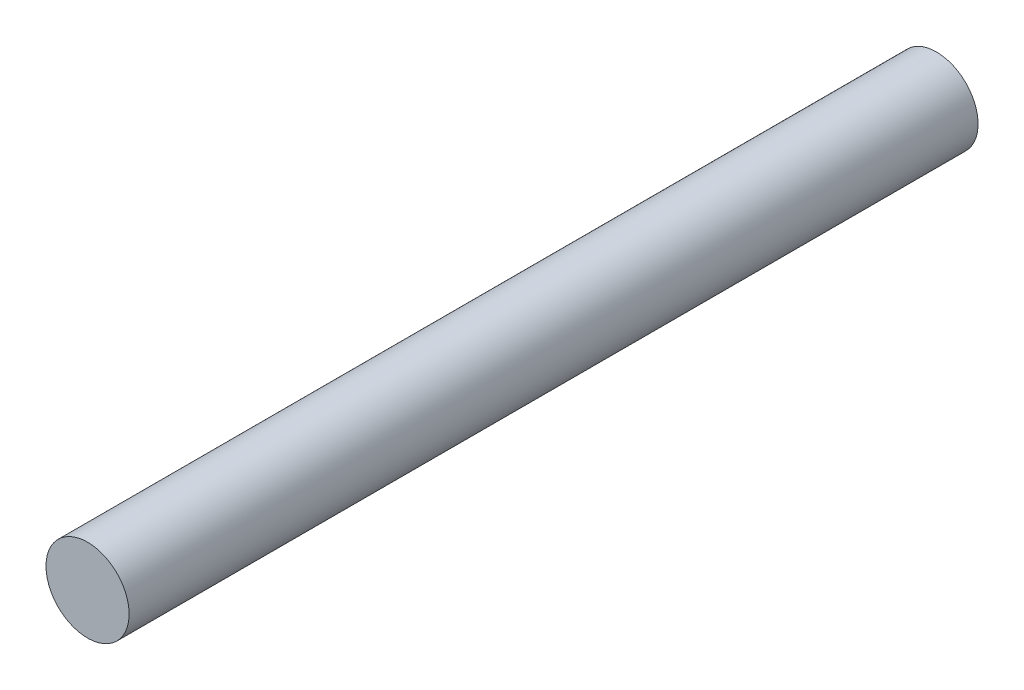
ISO-10303-21;
HEADER;
FILE_DESCRIPTION(('STEP AP214'),'2;1');
FILE_NAME('part.step','',(''),(''),'','','');
FILE_SCHEMA(('AUTOMOTIVE_DESIGN { 1 0 10303 214 1 1 1 1 }'));
ENDSEC;
DATA;
#1=APPLICATION_CONTEXT('core data for automotive mechanical design processes');
#2=APPLICATION_PROTOCOL_DEFINITION('international standard','automotive_design',2000,#1);
#3=PRODUCT_CONTEXT('',#1,'mechanical');
#4=PRODUCT('Part','Part','',(#3));
#5=PRODUCT_RELATED_PRODUCT_CATEGORY('part','',(#4));
#6=PRODUCT_DEFINITION_FORMATION('','',#4);
#7=PRODUCT_DEFINITION_CONTEXT('part definition',#1,'design');
#8=PRODUCT_DEFINITION('design','',#6,#7);
#9=PRODUCT_DEFINITION_SHAPE('','',#8);
#10=(LENGTH_UNIT() NAMED_UNIT(*) SI_UNIT(.MILLI.,.METRE.));
#11=(NAMED_UNIT(*) PLANE_ANGLE_UNIT() SI_UNIT($,.RADIAN.));
#12=(NAMED_UNIT(*) SI_UNIT($,.STERADIAN.) SOLID_ANGLE_UNIT());
#13=UNCERTAINTY_MEASURE_WITH_UNIT(LENGTH_MEASURE(1.E-05),#10,'distance_accuracy_value','');
#14=(GEOMETRIC_REPRESENTATION_CONTEXT(3) GLOBAL_UNCERTAINTY_ASSIGNED_CONTEXT((#13)) GLOBAL_UNIT_ASSIGNED_CONTEXT((#10,
#11,#12)) REPRESENTATION_CONTEXT('',''));
#15=CARTESIAN_POINT('',(0.,0.,0.));
#16=DIRECTION('',(0.,0.,1.));
#17=DIRECTION('',(1.,0.,0.));
#18=AXIS2_PLACEMENT_3D('',#15,#16,#17);
#19=CARTESIAN_POINT('',(0.,0.,97.282));
#20=DIRECTION('',(0.,0.,-1.));
#21=DIRECTION('',(-1.,0.,0.));
#22=AXIS2_PLACEMENT_3D('',#19,#20,#21);
#23=CYLINDRICAL_SURFACE('',#22,4.7625);
#24=CARTESIAN_POINT('',(0.,0.,97.282));
#25=DIRECTION('',(0.,0.,1.));
#26=DIRECTION('',(1.,0.,0.));
#27=AXIS2_PLACEMENT_3D('',#24,#25,#26);
#28=CIRCLE('',#27,4.7625);
#29=CARTESIAN_POINT('',(-4.7625,0.,97.282));
#30=VERTEX_POINT('',#29);
#31=EDGE_CURVE('E12',#30,#30,#28,.T.);
#32=CARTESIAN_POINT('',(0.,0.,0.));
#33=DIRECTION('',(0.,0.,1.));
#34=DIRECTION('',(1.,0.,0.));
#35=AXIS2_PLACEMENT_3D('',#32,#33,#34);
#36=CIRCLE('',#35,4.7625);
#37=CARTESIAN_POINT('',(-4.7625,0.,0.));
#38=VERTEX_POINT('',#37);
#39=EDGE_CURVE('E44',#38,#38,#36,.T.);
#40=CARTESIAN_POINT('',(-4.7625,0.,97.282));
#41=CARTESIAN_POINT('',(-4.7625,0.,96.2686458333333));
#42=CARTESIAN_POINT('',(-4.7625,0.,95.2552916666667));
#43=CARTESIAN_POINT('',(-4.7625,0.,93.2285833333333));
#44=CARTESIAN_POINT('',(-4.7625,0.,92.2152291666666));
#45=CARTESIAN_POINT('',(-4.7625,0.,90.1885208333333));
#46=CARTESIAN_POINT('',(-4.7625,0.,89.1751666666667));
#47=CARTESIAN_POINT('',(-4.7625,0.,87.1484583333333));
#48=CARTESIAN_POINT('',(-4.7625,0.,86.1351041666667));
#49=CARTESIAN_POINT('',(-4.7625,0.,84.1083958333333));
#50=CARTESIAN_POINT('',(-4.7625,0.,83.0950416666666));
#51=CARTESIAN_POINT('',(-4.7625,0.,81.0683333333333));
#52=CARTESIAN_POINT('',(-4.7625,0.,80.0549791666667));
#53=CARTESIAN_POINT('',(-4.7625,0.,78.0282708333333));
#54=CARTESIAN_POINT('',(-4.7625,0.,77.0149166666667));
#55=CARTESIAN_POINT('',(-4.7625,0.,74.9882083333333));
#56=CARTESIAN_POINT('',(-4.7625,0.,73.9748541666666));
#57=CARTESIAN_POINT('',(-4.7625,0.,71.9481458333333));
#58=CARTESIAN_POINT('',(-4.7625,0.,70.9347916666667));
#59=CARTESIAN_POINT('',(-4.7625,0.,68.9080833333333));
#60=CARTESIAN_POINT('',(-4.7625,0.,67.8947291666667));
#61=CARTESIAN_POINT('',(-4.7625,0.,65.8680208333333));
#62=CARTESIAN_POINT('',(-4.7625,0.,64.8546666666667));
#63=CARTESIAN_POINT('',(-4.7625,0.,62.8279583333333));
#64=CARTESIAN_POINT('',(-4.7625,0.,61.8146041666667));
#65=CARTESIAN_POINT('',(-4.7625,0.,59.7878958333333));
#66=CARTESIAN_POINT('',(-4.7625,0.,58.7745416666667));
#67=CARTESIAN_POINT('',(-4.7625,0.,56.7478333333333));
#68=CARTESIAN_POINT('',(-4.7625,0.,55.7344791666667));
#69=CARTESIAN_POINT('',(-4.7625,0.,53.7077708333333));
#70=CARTESIAN_POINT('',(-4.7625,0.,52.6944166666667));
#71=CARTESIAN_POINT('',(-4.7625,0.,50.6677083333333));
#72=CARTESIAN_POINT('',(-4.7625,0.,49.6543541666667));
#73=CARTESIAN_POINT('',(-4.7625,0.,47.6276458333333));
#74=CARTESIAN_POINT('',(-4.7625,0.,46.6142916666667));
#75=CARTESIAN_POINT('',(-4.7625,0.,44.5875833333333));
#76=CARTESIAN_POINT('',(-4.7625,0.,43.5742291666667));
#77=CARTESIAN_POINT('',(-4.7625,0.,41.5475208333333));
#78=CARTESIAN_POINT('',(-4.7625,0.,40.5341666666667));
#79=CARTESIAN_POINT('',(-4.7625,0.,38.5074583333333));
#80=CARTESIAN_POINT('',(-4.7625,0.,37.4941041666667));
#81=CARTESIAN_POINT('',(-4.7625,0.,35.4673958333333));
#82=CARTESIAN_POINT('',(-4.7625,0.,34.4540416666667));
#83=CARTESIAN_POINT('',(-4.7625,0.,32.4273333333333));
#84=CARTESIAN_POINT('',(-4.7625,0.,31.4139791666667));
#85=CARTESIAN_POINT('',(-4.7625,0.,29.3872708333333));
#86=CARTESIAN_POINT('',(-4.7625,0.,28.3739166666667));
#87=CARTESIAN_POINT('',(-4.7625,0.,26.3472083333333));
#88=CARTESIAN_POINT('',(-4.7625,0.,25.3338541666667));
#89=CARTESIAN_POINT('',(-4.7625,0.,23.3071458333333));
#90=CARTESIAN_POINT('',(-4.7625,0.,22.2937916666667));
#91=CARTESIAN_POINT('',(-4.7625,0.,20.2670833333333));
#92=CARTESIAN_POINT('',(-4.7625,0.,19.2537291666667));
#93=CARTESIAN_POINT('',(-4.7625,0.,17.2270208333333));
#94=CARTESIAN_POINT('',(-4.7625,0.,16.2136666666667));
#95=CARTESIAN_POINT('',(-4.7625,0.,14.1869583333333));
#96=CARTESIAN_POINT('',(-4.7625,0.,13.1736041666667));
#97=CARTESIAN_POINT('',(-4.7625,0.,11.1468958333333));
#98=CARTESIAN_POINT('',(-4.7625,0.,10.1335416666667));
#99=CARTESIAN_POINT('',(-4.7625,0.,8.10683333333334));
#100=CARTESIAN_POINT('',(-4.7625,0.,7.09347916666667));
#101=CARTESIAN_POINT('',(-4.7625,0.,5.06677083333334));
#102=CARTESIAN_POINT('',(-4.7625,0.,4.05341666666667));
#103=CARTESIAN_POINT('',(-4.7625,0.,2.02670833333333));
#104=CARTESIAN_POINT('',(-4.7625,0.,1.01335416666667));
#105=CARTESIAN_POINT('',(-4.7625,0.,0.));
#106=B_SPLINE_CURVE_WITH_KNOTS('',3,(#40,#41,#42,#43,#44,#45,#46,#47,#48,#49,#50,#51,#52,#53,
#54,#55,#56,#57,#58,#59,#60,#61,#62,#63,#64,#65,#66,#67,#68,#69,#70,#71,#72,#73,#74,#75,#76,#77,
#78,#79,#80,#81,#82,#83,#84,#85,#86,#87,#88,#89,#90,#91,#92,#93,#94,#95,#96,#97,#98,#99,#100,
#101,#102,#103,#104,#105),.UNSPECIFIED.,.F.,.F.,(4,2,2,2,2,2,2,2,2,2,2,2,2,2,2,2,2,2,2,2,2,2,2,
2,2,2,2,2,2,2,2,2,4),(0.,3.04006250000001,6.08012500000001,9.1201875,12.16025,15.2003125,
18.240375,21.2804375,24.3205,27.3605625,30.400625,33.4406875,36.48075,39.5208125,42.560875,
45.6009375,48.641,51.6810625,54.721125,57.7611875,60.80125,63.8413125,66.881375,69.9214375,
72.9615,76.0015625,79.041625,82.0816875,85.12175,88.1618125,91.201875,94.2419375,97.282),.UNSPECIFIED.);
#107=EDGE_CURVE('BSEAM41',#30,#38,#106,.T.);
#108=ORIENTED_EDGE('',*,*,#31,.F.);
#109=ORIENTED_EDGE('',*,*,#39,.T.);
#110=ORIENTED_EDGE('',*,*,#107,.T.);
#111=ORIENTED_EDGE('',*,*,#107,.F.);
#112=EDGE_LOOP('',(#108,#110,#109,#111));
#113=FACE_BOUND('',#112,.T.);
#114=ADVANCED_FACE('F41',(#113),#23,.T.);
#115=CARTESIAN_POINT('',(0.,0.,97.282));
#116=DIRECTION('',(0.,0.,1.));
#117=DIRECTION('',(1.,0.,0.));
#118=AXIS2_PLACEMENT_3D('',#115,#116,#117);
#119=PLANE('',#118);
#120=ORIENTED_EDGE('',*,*,#31,.T.);
#121=EDGE_LOOP('',(#120));
#122=FACE_BOUND('',#121,.T.);
#123=ADVANCED_FACE('F56',(#122),#119,.T.);
#124=CARTESIAN_POINT('',(0.,0.,0.));
#125=DIRECTION('',(0.,0.,1.));
#126=DIRECTION('',(1.,0.,0.));
#127=AXIS2_PLACEMENT_3D('',#124,#125,#126);
#128=PLANE('',#127);
#129=ORIENTED_EDGE('',*,*,#39,.F.);
#130=EDGE_LOOP('',(#129));
#131=FACE_BOUND('',#130,.T.);
#132=ADVANCED_FACE('F54',(#131),#128,.F.);
#133=CLOSED_SHELL('',(#114,#123,#132));
#134=MANIFOLD_SOLID_BREP('B2',#133);
#135=ADVANCED_BREP_SHAPE_REPRESENTATION('',(#18,#134),#14);
#136=SHAPE_DEFINITION_REPRESENTATION(#9,#135);
ENDSEC;
END-ISO-10303-21;
